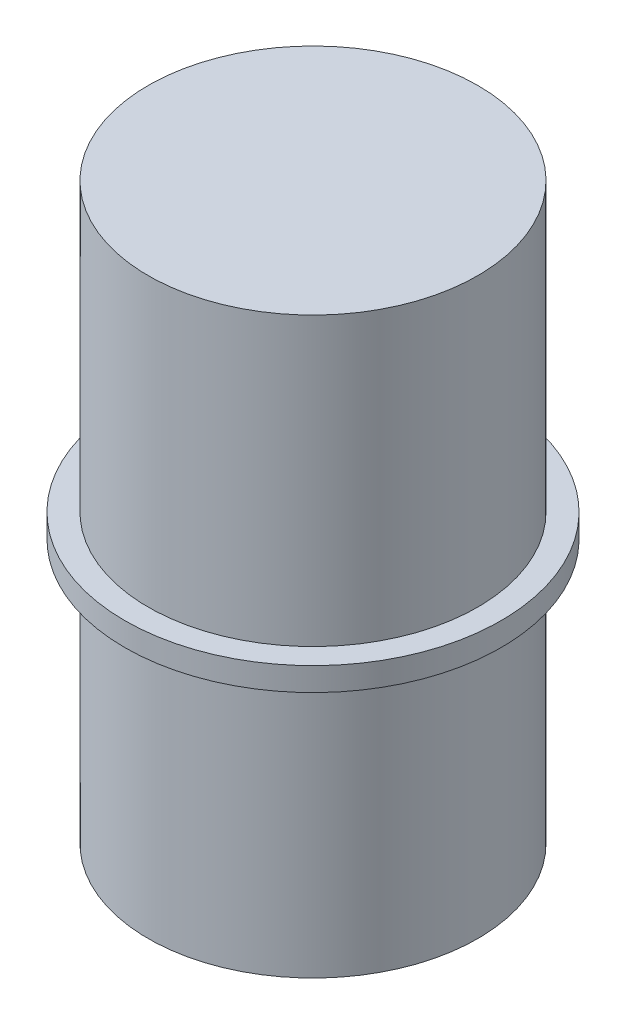
ISO-10303-21;
HEADER;
FILE_DESCRIPTION(('STEP AP214'),'2;1');
FILE_NAME('part.step','',(''),(''),'','','');
FILE_SCHEMA(('AUTOMOTIVE_DESIGN { 1 0 10303 214 1 1 1 1 }'));
ENDSEC;
DATA;
#1=APPLICATION_CONTEXT('core data for automotive mechanical design processes');
#2=APPLICATION_PROTOCOL_DEFINITION('international standard','automotive_design',2000,#1);
#3=PRODUCT_CONTEXT('',#1,'mechanical');
#4=PRODUCT('Part','Part','',(#3));
#5=PRODUCT_RELATED_PRODUCT_CATEGORY('part','',(#4));
#6=PRODUCT_DEFINITION_FORMATION('','',#4);
#7=PRODUCT_DEFINITION_CONTEXT('part definition',#1,'design');
#8=PRODUCT_DEFINITION('design','',#6,#7);
#9=PRODUCT_DEFINITION_SHAPE('','',#8);
#10=(LENGTH_UNIT() NAMED_UNIT(*) SI_UNIT(.MILLI.,.METRE.));
#11=(NAMED_UNIT(*) PLANE_ANGLE_UNIT() SI_UNIT($,.RADIAN.));
#12=(NAMED_UNIT(*) SI_UNIT($,.STERADIAN.) SOLID_ANGLE_UNIT());
#13=UNCERTAINTY_MEASURE_WITH_UNIT(LENGTH_MEASURE(1.E-05),#10,'distance_accuracy_value','');
#14=(GEOMETRIC_REPRESENTATION_CONTEXT(3) GLOBAL_UNCERTAINTY_ASSIGNED_CONTEXT((#13)) GLOBAL_UNIT_ASSIGNED_CONTEXT((#10,
#11,#12)) REPRESENTATION_CONTEXT('',''));
#15=CARTESIAN_POINT('',(0.,0.,0.));
#16=DIRECTION('',(0.,0.,1.));
#17=DIRECTION('',(1.,0.,0.));
#18=AXIS2_PLACEMENT_3D('',#15,#16,#17);
#19=CARTESIAN_POINT('',(0.,38.1,0.));
#20=DIRECTION('',(0.,-1.,0.));
#21=DIRECTION('',(0.,0.,-1.));
#22=AXIS2_PLACEMENT_3D('',#19,#20,#21);
#23=CYLINDRICAL_SURFACE('',#22,10.9347);
#24=CARTESIAN_POINT('',(0.,17.5,0.));
#25=DIRECTION('',(0.,1.,0.));
#26=DIRECTION('',(0.,0.,1.));
#27=AXIS2_PLACEMENT_3D('',#24,#25,#26);
#28=CIRCLE('',#27,10.9347);
#29=CARTESIAN_POINT('',(0.,17.5,-10.9347));
#30=VERTEX_POINT('',#29);
#31=EDGE_CURVE('E52',#30,#30,#28,.T.);
#32=CARTESIAN_POINT('',(0.,0.,0.));
#33=DIRECTION('',(0.,1.,0.));
#34=DIRECTION('',(0.,0.,1.));
#35=AXIS2_PLACEMENT_3D('',#32,#33,#34);
#36=CIRCLE('',#35,10.9347);
#37=CARTESIAN_POINT('',(0.,0.,-10.9347));
#38=VERTEX_POINT('',#37);
#39=EDGE_CURVE('E35',#38,#38,#36,.T.);
#40=CARTESIAN_POINT('',(0.,17.5,-10.9347));
#41=CARTESIAN_POINT('',(0.,17.3177083333334,-10.9347));
#42=CARTESIAN_POINT('',(0.,17.1354166666667,-10.9347));
#43=CARTESIAN_POINT('',(0.,16.7708333333334,-10.9347));
#44=CARTESIAN_POINT('',(0.,16.5885416666667,-10.9347));
#45=CARTESIAN_POINT('',(0.,16.2239583333334,-10.9347));
#46=CARTESIAN_POINT('',(0.,16.0416666666667,-10.9347));
#47=CARTESIAN_POINT('',(0.,15.6770833333334,-10.9347));
#48=CARTESIAN_POINT('',(0.,15.4947916666667,-10.9347));
#49=CARTESIAN_POINT('',(0.,15.1302083333334,-10.9347));
#50=CARTESIAN_POINT('',(0.,14.9479166666667,-10.9347));
#51=CARTESIAN_POINT('',(0.,14.5833333333334,-10.9347));
#52=CARTESIAN_POINT('',(0.,14.4010416666667,-10.9347));
#53=CARTESIAN_POINT('',(0.,14.0364583333334,-10.9347));
#54=CARTESIAN_POINT('',(0.,13.8541666666667,-10.9347));
#55=CARTESIAN_POINT('',(0.,13.4895833333334,-10.9347));
#56=CARTESIAN_POINT('',(0.,13.3072916666667,-10.9347));
#57=CARTESIAN_POINT('',(0.,12.9427083333334,-10.9347));
#58=CARTESIAN_POINT('',(0.,12.7604166666667,-10.9347));
#59=CARTESIAN_POINT('',(0.,12.3958333333334,-10.9347));
#60=CARTESIAN_POINT('',(0.,12.2135416666667,-10.9347));
#61=CARTESIAN_POINT('',(0.,11.8489583333333,-10.9347));
#62=CARTESIAN_POINT('',(0.,11.6666666666667,-10.9347));
#63=CARTESIAN_POINT('',(0.,11.3020833333333,-10.9347));
#64=CARTESIAN_POINT('',(0.,11.1197916666667,-10.9347));
#65=CARTESIAN_POINT('',(0.,10.7552083333333,-10.9347));
#66=CARTESIAN_POINT('',(0.,10.5729166666667,-10.9347));
#67=CARTESIAN_POINT('',(0.,10.2083333333333,-10.9347));
#68=CARTESIAN_POINT('',(0.,10.0260416666667,-10.9347));
#69=CARTESIAN_POINT('',(0.,9.66145833333335,-10.9347));
#70=CARTESIAN_POINT('',(0.,9.47916666666668,-10.9347));
#71=CARTESIAN_POINT('',(0.,9.11458333333335,-10.9347));
#72=CARTESIAN_POINT('',(0.,8.93229166666668,-10.9347));
#73=CARTESIAN_POINT('',(0.,8.56770833333334,-10.9347));
#74=CARTESIAN_POINT('',(0.,8.38541666666668,-10.9347));
#75=CARTESIAN_POINT('',(0.,8.02083333333334,-10.9347));
#76=CARTESIAN_POINT('',(0.,7.83854166666668,-10.9347));
#77=CARTESIAN_POINT('',(0.,7.47395833333334,-10.9347));
#78=CARTESIAN_POINT('',(0.,7.29166666666668,-10.9347));
#79=CARTESIAN_POINT('',(0.,6.92708333333334,-10.9347));
#80=CARTESIAN_POINT('',(0.,6.74479166666668,-10.9347));
#81=CARTESIAN_POINT('',(0.,6.38020833333335,-10.9347));
#82=CARTESIAN_POINT('',(0.,6.19791666666668,-10.9347));
#83=CARTESIAN_POINT('',(0.,5.83333333333334,-10.9347));
#84=CARTESIAN_POINT('',(0.,5.65104166666668,-10.9347));
#85=CARTESIAN_POINT('',(0.,5.28645833333334,-10.9347));
#86=CARTESIAN_POINT('',(0.,5.10416666666667,-10.9347));
#87=CARTESIAN_POINT('',(0.,4.73958333333334,-10.9347));
#88=CARTESIAN_POINT('',(0.,4.55729166666667,-10.9347));
#89=CARTESIAN_POINT('',(0.,4.19270833333334,-10.9347));
#90=CARTESIAN_POINT('',(0.,4.01041666666667,-10.9347));
#91=CARTESIAN_POINT('',(0.,3.64583333333334,-10.9347));
#92=CARTESIAN_POINT('',(0.,3.46354166666667,-10.9347));
#93=CARTESIAN_POINT('',(0.,3.09895833333334,-10.9347));
#94=CARTESIAN_POINT('',(0.,2.91666666666667,-10.9347));
#95=CARTESIAN_POINT('',(0.,2.55208333333334,-10.9347));
#96=CARTESIAN_POINT('',(0.,2.36979166666667,-10.9347));
#97=CARTESIAN_POINT('',(0.,2.00520833333334,-10.9347));
#98=CARTESIAN_POINT('',(0.,1.82291666666667,-10.9347));
#99=CARTESIAN_POINT('',(0.,1.45833333333334,-10.9347));
#100=CARTESIAN_POINT('',(0.,1.27604166666667,-10.9347));
#101=CARTESIAN_POINT('',(0.,0.911458333333337,-10.9347));
#102=CARTESIAN_POINT('',(0.,0.72916666666667,-10.9347));
#103=CARTESIAN_POINT('',(0.,0.364583333333335,-10.9347));
#104=CARTESIAN_POINT('',(0.,0.182291666666668,-10.9347));
#105=CARTESIAN_POINT('',(0.,0.,-10.9347));
#106=B_SPLINE_CURVE_WITH_KNOTS('',3,(#40,#41,#42,#43,#44,#45,#46,#47,#48,#49,#50,#51,#52,#53,
#54,#55,#56,#57,#58,#59,#60,#61,#62,#63,#64,#65,#66,#67,#68,#69,#70,#71,#72,#73,#74,#75,#76,#77,
#78,#79,#80,#81,#82,#83,#84,#85,#86,#87,#88,#89,#90,#91,#92,#93,#94,#95,#96,#97,#98,#99,#100,
#101,#102,#103,#104,#105),.UNSPECIFIED.,.F.,.F.,(4,2,2,2,2,2,2,2,2,2,2,2,2,2,2,2,2,2,2,2,2,2,2,
2,2,2,2,2,2,2,2,2,4),(0.,0.546875000000002,1.09375,1.640625,2.1875,2.734375,3.28125000000001,
3.82812500000001,4.37500000000001,4.92187500000001,5.46875000000001,6.01562500000001,
6.56250000000001,7.10937500000001,7.65625000000001,8.20312500000001,8.75000000000001,
9.29687500000002,9.84375000000002,10.390625,10.9375,11.484375,12.03125,12.578125,13.125,
13.671875,14.21875,14.765625,15.3125,15.859375,16.40625,16.953125,17.5),.UNSPECIFIED.);
#107=EDGE_CURVE('BSEAM31',#30,#38,#106,.T.);
#108=ORIENTED_EDGE('',*,*,#31,.F.);
#109=ORIENTED_EDGE('',*,*,#39,.T.);
#110=ORIENTED_EDGE('',*,*,#107,.T.);
#111=ORIENTED_EDGE('',*,*,#107,.F.);
#112=EDGE_LOOP('',(#108,#110,#109,#111));
#113=FACE_BOUND('',#112,.T.);
#114=ADVANCED_FACE('F31',(#113),#23,.T.);
#115=CARTESIAN_POINT('',(0.,0.,0.));
#116=DIRECTION('',(0.,1.,0.));
#117=DIRECTION('',(0.,0.,1.));
#118=AXIS2_PLACEMENT_3D('',#115,#116,#117);
#119=PLANE('',#118);
#120=ORIENTED_EDGE('',*,*,#39,.F.);
#121=EDGE_LOOP('',(#120));
#122=FACE_BOUND('',#121,.T.);
#123=ADVANCED_FACE('F61',(#122),#119,.F.);
#124=CARTESIAN_POINT('',(-10.9347,17.5,0.));
#125=DIRECTION('',(0.,-1.,0.));
#126=DIRECTION('',(0.,0.,-1.));
#127=AXIS2_PLACEMENT_3D('',#124,#125,#126);
#128=PLANE('',#127);
#129=ORIENTED_EDGE('',*,*,#31,.T.);
#130=EDGE_LOOP('',(#129));
#131=FACE_BOUND('',#130,.T.);
#132=CARTESIAN_POINT('',(0.,17.5,0.));
#133=DIRECTION('',(0.,1.,0.));
#134=DIRECTION('',(0.,0.,1.));
#135=AXIS2_PLACEMENT_3D('',#132,#133,#134);
#136=CIRCLE('',#135,12.4847);
#137=CARTESIAN_POINT('',(0.,17.5,12.4847));
#138=VERTEX_POINT('',#137);
#139=EDGE_CURVE('E42',#138,#138,#136,.T.);
#140=ORIENTED_EDGE('',*,*,#139,.F.);
#141=EDGE_LOOP('',(#140));
#142=FACE_BOUND('',#141,.T.);
#143=ADVANCED_FACE('F56',(#131,#142),#128,.T.);
#144=CARTESIAN_POINT('',(0.,38.1,0.));
#145=DIRECTION('',(0.,1.,0.));
#146=DIRECTION('',(0.,0.,1.));
#147=AXIS2_PLACEMENT_3D('',#144,#145,#146);
#148=CYLINDRICAL_SURFACE('',#147,12.4847);
#149=ORIENTED_EDGE('',*,*,#139,.T.);
#150=EDGE_LOOP('',(#149));
#151=FACE_BOUND('',#150,.T.);
#152=CARTESIAN_POINT('',(0.,19.05,0.));
#153=DIRECTION('',(0.,1.,0.));
#154=DIRECTION('',(0.,0.,1.));
#155=AXIS2_PLACEMENT_3D('',#152,#153,#154);
#156=CIRCLE('',#155,12.4847);
#157=CARTESIAN_POINT('',(0.,19.05,12.4847));
#158=VERTEX_POINT('',#157);
#159=EDGE_CURVE('E46',#158,#158,#156,.T.);
#160=ORIENTED_EDGE('',*,*,#159,.F.);
#161=EDGE_LOOP('',(#160));
#162=FACE_BOUND('',#161,.T.);
#163=ADVANCED_FACE('F70',(#151,#162),#148,.T.);
#164=CARTESIAN_POINT('',(-10.9347,19.05,0.));
#165=DIRECTION('',(0.,1.,0.));
#166=DIRECTION('',(0.,0.,1.));
#167=AXIS2_PLACEMENT_3D('',#164,#165,#166);
#168=PLANE('',#167);
#169=ORIENTED_EDGE('',*,*,#159,.T.);
#170=EDGE_LOOP('',(#169));
#171=FACE_BOUND('',#170,.T.);
#172=CARTESIAN_POINT('',(0.,19.05,0.));
#173=DIRECTION('',(0.,1.,0.));
#174=DIRECTION('',(0.,0.,1.));
#175=AXIS2_PLACEMENT_3D('',#172,#173,#174);
#176=CIRCLE('',#175,10.9347);
#177=CARTESIAN_POINT('',(0.,19.05,-10.9347));
#178=VERTEX_POINT('',#177);
#179=EDGE_CURVE('E49',#178,#178,#176,.T.);
#180=ORIENTED_EDGE('',*,*,#179,.F.);
#181=EDGE_LOOP('',(#180));
#182=FACE_BOUND('',#181,.T.);
#183=ADVANCED_FACE('F74',(#171,#182),#168,.T.);
#184=CARTESIAN_POINT('',(0.,38.1,0.));
#185=DIRECTION('',(0.,1.,0.));
#186=DIRECTION('',(0.,0.,1.));
#187=AXIS2_PLACEMENT_3D('',#184,#185,#186);
#188=PLANE('',#187);
#189=CARTESIAN_POINT('',(0.,38.1,0.));
#190=DIRECTION('',(0.,1.,0.));
#191=DIRECTION('',(0.,0.,1.));
#192=AXIS2_PLACEMENT_3D('',#189,#190,#191);
#193=CIRCLE('',#192,10.9347);
#194=CARTESIAN_POINT('',(0.,38.1,-10.9347));
#195=VERTEX_POINT('',#194);
#196=EDGE_CURVE('E10',#195,#195,#193,.T.);
#197=ORIENTED_EDGE('',*,*,#196,.T.);
#198=EDGE_LOOP('',(#197));
#199=FACE_BOUND('',#198,.T.);
#200=ADVANCED_FACE('F73',(#199),#188,.T.);
#201=CARTESIAN_POINT('',(0.,19.05,-10.9347));
#202=CARTESIAN_POINT('',(0.,19.2484375,-10.9347));
#203=CARTESIAN_POINT('',(0.,19.446875,-10.9347));
#204=CARTESIAN_POINT('',(0.,19.84375,-10.9347));
#205=CARTESIAN_POINT('',(0.,20.0421875,-10.9347));
#206=CARTESIAN_POINT('',(0.,20.4390625,-10.9347));
#207=CARTESIAN_POINT('',(0.,20.6375,-10.9347));
#208=CARTESIAN_POINT('',(0.,21.034375,-10.9347));
#209=CARTESIAN_POINT('',(0.,21.2328125,-10.9347));
#210=CARTESIAN_POINT('',(0.,21.6296875,-10.9347));
#211=CARTESIAN_POINT('',(0.,21.828125,-10.9347));
#212=CARTESIAN_POINT('',(0.,22.225,-10.9347));
#213=CARTESIAN_POINT('',(0.,22.4234375,-10.9347));
#214=CARTESIAN_POINT('',(0.,22.8203125,-10.9347));
#215=CARTESIAN_POINT('',(0.,23.01875,-10.9347));
#216=CARTESIAN_POINT('',(0.,23.415625,-10.9347));
#217=CARTESIAN_POINT('',(0.,23.6140625,-10.9347));
#218=CARTESIAN_POINT('',(0.,24.0109375,-10.9347));
#219=CARTESIAN_POINT('',(0.,24.209375,-10.9347));
#220=CARTESIAN_POINT('',(0.,24.60625,-10.9347));
#221=CARTESIAN_POINT('',(0.,24.8046875,-10.9347));
#222=CARTESIAN_POINT('',(0.,25.2015625,-10.9347));
#223=CARTESIAN_POINT('',(0.,25.4,-10.9347));
#224=CARTESIAN_POINT('',(0.,25.796875,-10.9347));
#225=CARTESIAN_POINT('',(0.,25.9953125,-10.9347));
#226=CARTESIAN_POINT('',(0.,26.3921875,-10.9347));
#227=CARTESIAN_POINT('',(0.,26.590625,-10.9347));
#228=CARTESIAN_POINT('',(0.,26.9875,-10.9347));
#229=CARTESIAN_POINT('',(0.,27.1859375,-10.9347));
#230=CARTESIAN_POINT('',(0.,27.5828125,-10.9347));
#231=CARTESIAN_POINT('',(0.,27.78125,-10.9347));
#232=CARTESIAN_POINT('',(0.,28.178125,-10.9347));
#233=CARTESIAN_POINT('',(0.,28.3765625,-10.9347));
#234=CARTESIAN_POINT('',(0.,28.7734375,-10.9347));
#235=CARTESIAN_POINT('',(0.,28.971875,-10.9347));
#236=CARTESIAN_POINT('',(0.,29.36875,-10.9347));
#237=CARTESIAN_POINT('',(0.,29.5671875,-10.9347));
#238=CARTESIAN_POINT('',(0.,29.9640625,-10.9347));
#239=CARTESIAN_POINT('',(0.,30.1625,-10.9347));
#240=CARTESIAN_POINT('',(0.,30.559375,-10.9347));
#241=CARTESIAN_POINT('',(0.,30.7578125,-10.9347));
#242=CARTESIAN_POINT('',(0.,31.1546875,-10.9347));
#243=CARTESIAN_POINT('',(0.,31.353125,-10.9347));
#244=CARTESIAN_POINT('',(0.,31.75,-10.9347));
#245=CARTESIAN_POINT('',(0.,31.9484375,-10.9347));
#246=CARTESIAN_POINT('',(0.,32.3453125,-10.9347));
#247=CARTESIAN_POINT('',(0.,32.54375,-10.9347));
#248=CARTESIAN_POINT('',(0.,32.940625,-10.9347));
#249=CARTESIAN_POINT('',(0.,33.1390625,-10.9347));
#250=CARTESIAN_POINT('',(0.,33.5359375,-10.9347));
#251=CARTESIAN_POINT('',(0.,33.734375,-10.9347));
#252=CARTESIAN_POINT('',(0.,34.13125,-10.9347));
#253=CARTESIAN_POINT('',(0.,34.3296875,-10.9347));
#254=CARTESIAN_POINT('',(0.,34.7265625,-10.9347));
#255=CARTESIAN_POINT('',(0.,34.925,-10.9347));
#256=CARTESIAN_POINT('',(0.,35.321875,-10.9347));
#257=CARTESIAN_POINT('',(0.,35.5203125,-10.9347));
#258=CARTESIAN_POINT('',(0.,35.9171875,-10.9347));
#259=CARTESIAN_POINT('',(0.,36.115625,-10.9347));
#260=CARTESIAN_POINT('',(0.,36.5125,-10.9347));
#261=CARTESIAN_POINT('',(0.,36.7109375,-10.9347));
#262=CARTESIAN_POINT('',(0.,37.1078125,-10.9347));
#263=CARTESIAN_POINT('',(0.,37.30625,-10.9347));
#264=CARTESIAN_POINT('',(0.,37.703125,-10.9347));
#265=CARTESIAN_POINT('',(0.,37.9015625,-10.9347));
#266=CARTESIAN_POINT('',(0.,38.1,-10.9347));
#267=B_SPLINE_CURVE_WITH_KNOTS('',3,(#201,#202,#203,#204,#205,#206,#207,#208,#209,#210,#211,
#212,#213,#214,#215,#216,#217,#218,#219,#220,#221,#222,#223,#224,#225,#226,#227,#228,#229,#230,
#231,#232,#233,#234,#235,#236,#237,#238,#239,#240,#241,#242,#243,#244,#245,#246,#247,#248,#249,
#250,#251,#252,#253,#254,#255,#256,#257,#258,#259,#260,#261,#262,#263,#264,#265,#266),
.UNSPECIFIED.,.F.,.F.,(4,2,2,2,2,2,2,2,2,2,2,2,2,2,2,2,2,2,2,2,2,2,2,2,2,2,2,2,2,2,2,2,4),(0.,
0.5953125,1.190625,1.7859375,2.38125,2.9765625,3.571875,4.1671875,4.7625,5.3578125,5.953125,
6.54843749999999,7.14374999999999,7.73906249999999,8.33437499999999,8.92968749999999,9.525,
10.1203125,10.715625,11.3109375,11.90625,12.5015625,13.096875,13.6921875,14.2875,14.8828125,
15.478125,16.0734375,16.66875,17.2640625,17.859375,18.4546875,19.05),.UNSPECIFIED.);
#268=EDGE_CURVE('BSEAM33',#178,#195,#267,.T.);
#269=ORIENTED_EDGE('',*,*,#179,.T.);
#270=ORIENTED_EDGE('',*,*,#196,.F.);
#271=ORIENTED_EDGE('',*,*,#268,.T.);
#272=ORIENTED_EDGE('',*,*,#268,.F.);
#273=EDGE_LOOP('',(#269,#271,#270,#272));
#274=FACE_BOUND('',#273,.T.);
#275=ADVANCED_FACE('F33',(#274),#23,.T.);
#276=CLOSED_SHELL('',(#114,#123,#143,#163,#183,#200,#275));
#277=MANIFOLD_SOLID_BREP('B2',#276);
#278=ADVANCED_BREP_SHAPE_REPRESENTATION('',(#18,#277),#14);
#279=SHAPE_DEFINITION_REPRESENTATION(#9,#278);
ENDSEC;
END-ISO-10303-21;
